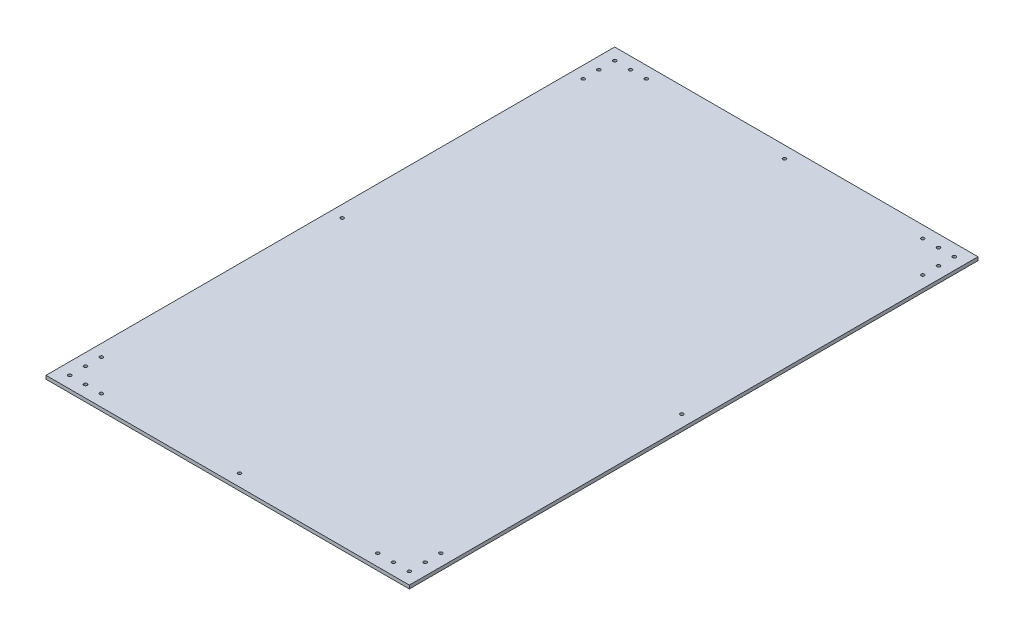
ISO-10303-21;
HEADER;
FILE_DESCRIPTION(('STEP AP214'),'2;1');
FILE_NAME('part.step','',(''),(''),'','','');
FILE_SCHEMA(('AUTOMOTIVE_DESIGN { 1 0 10303 214 1 1 1 1 }'));
ENDSEC;
DATA;
#1=APPLICATION_CONTEXT('core data for automotive mechanical design processes');
#2=APPLICATION_PROTOCOL_DEFINITION('international standard','automotive_design',2000,#1);
#3=PRODUCT_CONTEXT('',#1,'mechanical');
#4=PRODUCT('Part','Part','',(#3));
#5=PRODUCT_RELATED_PRODUCT_CATEGORY('part','',(#4));
#6=PRODUCT_DEFINITION_FORMATION('','',#4);
#7=PRODUCT_DEFINITION_CONTEXT('part definition',#1,'design');
#8=PRODUCT_DEFINITION('design','',#6,#7);
#9=PRODUCT_DEFINITION_SHAPE('','',#8);
#10=(LENGTH_UNIT() NAMED_UNIT(*) SI_UNIT(.MILLI.,.METRE.));
#11=(NAMED_UNIT(*) PLANE_ANGLE_UNIT() SI_UNIT($,.RADIAN.));
#12=(NAMED_UNIT(*) SI_UNIT($,.STERADIAN.) SOLID_ANGLE_UNIT());
#13=UNCERTAINTY_MEASURE_WITH_UNIT(LENGTH_MEASURE(1.E-05),#10,'distance_accuracy_value','');
#14=(GEOMETRIC_REPRESENTATION_CONTEXT(3) GLOBAL_UNCERTAINTY_ASSIGNED_CONTEXT((#13)) GLOBAL_UNIT_ASSIGNED_CONTEXT((#10,
#11,#12)) REPRESENTATION_CONTEXT('',''));
#15=CARTESIAN_POINT('',(0.,0.,0.));
#16=DIRECTION('',(0.,0.,1.));
#17=DIRECTION('',(1.,0.,0.));
#18=AXIS2_PLACEMENT_3D('',#15,#16,#17);
#19=CARTESIAN_POINT('',(304.8,5.5,-609.6));
#20=DIRECTION('',(-1.,0.,0.));
#21=DIRECTION('',(0.,0.,1.));
#22=AXIS2_PLACEMENT_3D('',#19,#20,#21);
#23=PLANE('',#22);
#24=DIRECTION('',(0.,0.,-1.));
#25=VECTOR('',#24,1.);
#26=CARTESIAN_POINT('',(304.8,0.,-609.6));
#27=LINE('',#26,#25);
#28=CARTESIAN_POINT('',(304.8,0.,609.6));
#29=VERTEX_POINT('',#28);
#30=CARTESIAN_POINT('',(304.8,0.,-304.8));
#31=VERTEX_POINT('',#30);
#32=EDGE_CURVE('E285',#29,#31,#27,.T.);
#33=ORIENTED_EDGE('',*,*,#32,.T.);
#34=DIRECTION('',(0.,-1.,0.));
#35=VECTOR('',#34,1.);
#36=CARTESIAN_POINT('',(304.8,30.901,-304.8));
#37=LINE('',#36,#35);
#38=CARTESIAN_POINT('',(304.8,5.5,-304.8));
#39=VERTEX_POINT('',#38);
#40=EDGE_CURVE('E89',#39,#31,#37,.T.);
#41=ORIENTED_EDGE('',*,*,#40,.F.);
#42=DIRECTION('',(0.,0.,-1.));
#43=VECTOR('',#42,1.);
#44=CARTESIAN_POINT('',(304.8,5.5,-609.6));
#45=LINE('',#44,#43);
#46=CARTESIAN_POINT('',(304.8,5.5,609.6));
#47=VERTEX_POINT('',#46);
#48=EDGE_CURVE('E286',#47,#39,#45,.T.);
#49=ORIENTED_EDGE('',*,*,#48,.F.);
#50=DIRECTION('',(0.,-1.,0.));
#51=VECTOR('',#50,1.);
#52=CARTESIAN_POINT('',(304.8,5.5,609.6));
#53=LINE('',#52,#51);
#54=EDGE_CURVE('E12',#47,#29,#53,.T.);
#55=ORIENTED_EDGE('',*,*,#54,.T.);
#56=EDGE_LOOP('',(#33,#41,#49,#55));
#57=FACE_BOUND('',#56,.T.);
#58=ADVANCED_FACE('F75',(#57),#23,.F.);
#59=CARTESIAN_POINT('',(-304.8,5.5,609.6));
#60=DIRECTION('',(0.,0.,-1.));
#61=DIRECTION('',(-1.,0.,0.));
#62=AXIS2_PLACEMENT_3D('',#59,#60,#61);
#63=PLANE('',#62);
#64=DIRECTION('',(1.,0.,0.));
#65=VECTOR('',#64,1.);
#66=CARTESIAN_POINT('',(-304.8,5.5,609.6));
#67=LINE('',#66,#65);
#68=CARTESIAN_POINT('',(-279.4,5.5,609.6));
#69=VERTEX_POINT('',#68);
#70=EDGE_CURVE('E82',#69,#47,#67,.T.);
#71=ORIENTED_EDGE('',*,*,#70,.F.);
#72=DIRECTION('',(0.,-1.,0.));
#73=VECTOR('',#72,1.);
#74=CARTESIAN_POINT('',(-279.4,30.901,609.6));
#75=LINE('',#74,#73);
#76=CARTESIAN_POINT('',(-279.4,0.,609.6));
#77=VERTEX_POINT('',#76);
#78=EDGE_CURVE('E123',#69,#77,#75,.T.);
#79=ORIENTED_EDGE('',*,*,#78,.T.);
#80=DIRECTION('',(1.,0.,0.));
#81=VECTOR('',#80,1.);
#82=CARTESIAN_POINT('',(-304.8,0.,609.6));
#83=LINE('',#82,#81);
#84=EDGE_CURVE('E133',#77,#29,#83,.T.);
#85=ORIENTED_EDGE('',*,*,#84,.T.);
#86=ORIENTED_EDGE('',*,*,#54,.F.);
#87=EDGE_LOOP('',(#71,#79,#85,#86));
#88=FACE_BOUND('',#87,.T.);
#89=ADVANCED_FACE('F290',(#88),#63,.F.);
#90=CARTESIAN_POINT('',(0.,5.5,0.));
#91=DIRECTION('',(0.,1.,0.));
#92=DIRECTION('',(0.,0.,1.));
#93=AXIS2_PLACEMENT_3D('',#90,#91,#92);
#94=PLANE('',#93);
#95=CARTESIAN_POINT('',(-260.35,5.5,-285.75));
#96=DIRECTION('',(0.,1.,0.));
#97=DIRECTION('',(0.,0.,1.));
#98=AXIS2_PLACEMENT_3D('',#95,#96,#97);
#99=CIRCLE('',#98,2.64999999999999);
#100=CARTESIAN_POINT('',(-260.35,5.5,-283.1));
#101=VERTEX_POINT('',#100);
#102=EDGE_CURVE('E137',#101,#101,#99,.T.);
#103=ORIENTED_EDGE('',*,*,#102,.F.);
#104=EDGE_LOOP('',(#103));
#105=FACE_BOUND('',#104,.T.);
#106=CARTESIAN_POINT('',(-234.95,5.5,-285.75));
#107=DIRECTION('',(0.,1.,0.));
#108=DIRECTION('',(0.,0.,1.));
#109=AXIS2_PLACEMENT_3D('',#106,#107,#108);
#110=CIRCLE('',#109,2.65000000000001);
#111=CARTESIAN_POINT('',(-234.95,5.5,-283.1));
#112=VERTEX_POINT('',#111);
#113=EDGE_CURVE('E144',#112,#112,#110,.T.);
#114=ORIENTED_EDGE('',*,*,#113,.F.);
#115=EDGE_LOOP('',(#114));
#116=FACE_BOUND('',#115,.T.);
#117=CARTESIAN_POINT('',(-209.55,5.5,-285.75));
#118=DIRECTION('',(0.,1.,0.));
#119=DIRECTION('',(0.,0.,1.));
#120=AXIS2_PLACEMENT_3D('',#117,#118,#119);
#121=CIRCLE('',#120,2.64999999999999);
#122=CARTESIAN_POINT('',(-209.55,5.5,-283.1));
#123=VERTEX_POINT('',#122);
#124=EDGE_CURVE('E150',#123,#123,#121,.T.);
#125=ORIENTED_EDGE('',*,*,#124,.F.);
#126=EDGE_LOOP('',(#125));
#127=FACE_BOUND('',#126,.T.);
#128=CARTESIAN_POINT('',(-260.35,5.5,-260.35));
#129=DIRECTION('',(0.,1.,0.));
#130=DIRECTION('',(0.,0.,1.));
#131=AXIS2_PLACEMENT_3D('',#128,#129,#130);
#132=CIRCLE('',#131,2.64999999999999);
#133=CARTESIAN_POINT('',(-260.35,5.5,-257.7));
#134=VERTEX_POINT('',#133);
#135=EDGE_CURVE('E156',#134,#134,#132,.T.);
#136=ORIENTED_EDGE('',*,*,#135,.F.);
#137=EDGE_LOOP('',(#136));
#138=FACE_BOUND('',#137,.T.);
#139=CARTESIAN_POINT('',(-260.35,5.5,-234.95));
#140=DIRECTION('',(0.,1.,0.));
#141=DIRECTION('',(0.,0.,1.));
#142=AXIS2_PLACEMENT_3D('',#139,#140,#141);
#143=CIRCLE('',#142,2.64999999999999);
#144=CARTESIAN_POINT('',(-260.35,5.5,-232.3));
#145=VERTEX_POINT('',#144);
#146=EDGE_CURVE('E162',#145,#145,#143,.T.);
#147=ORIENTED_EDGE('',*,*,#146,.F.);
#148=EDGE_LOOP('',(#147));
#149=FACE_BOUND('',#148,.T.);
#150=CARTESIAN_POINT('',(12.7000000000002,5.5,-285.75));
#151=DIRECTION('',(0.,1.,0.));
#152=DIRECTION('',(0.,0.,1.));
#153=AXIS2_PLACEMENT_3D('',#150,#151,#152);
#154=CIRCLE('',#153,2.65);
#155=CARTESIAN_POINT('',(12.7000000000002,5.5,-283.1));
#156=VERTEX_POINT('',#155);
#157=EDGE_CURVE('E168',#156,#156,#154,.T.);
#158=ORIENTED_EDGE('',*,*,#157,.F.);
#159=EDGE_LOOP('',(#158));
#160=FACE_BOUND('',#159,.T.);
#161=CARTESIAN_POINT('',(234.95,5.5,-285.75));
#162=DIRECTION('',(0.,1.,0.));
#163=DIRECTION('',(0.,0.,1.));
#164=AXIS2_PLACEMENT_3D('',#161,#162,#163);
#165=CIRCLE('',#164,2.64999999999999);
#166=CARTESIAN_POINT('',(234.95,5.5,-283.1));
#167=VERTEX_POINT('',#166);
#168=EDGE_CURVE('E174',#167,#167,#165,.T.);
#169=ORIENTED_EDGE('',*,*,#168,.F.);
#170=EDGE_LOOP('',(#169));
#171=FACE_BOUND('',#170,.T.);
#172=CARTESIAN_POINT('',(260.35,5.5,-285.75));
#173=DIRECTION('',(0.,1.,0.));
#174=DIRECTION('',(0.,0.,1.));
#175=AXIS2_PLACEMENT_3D('',#172,#173,#174);
#176=CIRCLE('',#175,2.64999999999999);
#177=CARTESIAN_POINT('',(260.35,5.5,-283.1));
#178=VERTEX_POINT('',#177);
#179=EDGE_CURVE('E180',#178,#178,#176,.T.);
#180=ORIENTED_EDGE('',*,*,#179,.F.);
#181=EDGE_LOOP('',(#180));
#182=FACE_BOUND('',#181,.T.);
#183=CARTESIAN_POINT('',(285.75,5.5,-285.75));
#184=DIRECTION('',(0.,1.,0.));
#185=DIRECTION('',(0.,0.,1.));
#186=AXIS2_PLACEMENT_3D('',#183,#184,#185);
#187=CIRCLE('',#186,2.64999999999999);
#188=CARTESIAN_POINT('',(285.75,5.5,-283.1));
#189=VERTEX_POINT('',#188);
#190=EDGE_CURVE('E186',#189,#189,#187,.T.);
#191=ORIENTED_EDGE('',*,*,#190,.F.);
#192=EDGE_LOOP('',(#191));
#193=FACE_BOUND('',#192,.T.);
#194=CARTESIAN_POINT('',(285.75,5.5,-260.35));
#195=DIRECTION('',(0.,1.,0.));
#196=DIRECTION('',(0.,0.,1.));
#197=AXIS2_PLACEMENT_3D('',#194,#195,#196);
#198=CIRCLE('',#197,2.64999999999999);
#199=CARTESIAN_POINT('',(285.75,5.5,-257.7));
#200=VERTEX_POINT('',#199);
#201=EDGE_CURVE('E192',#200,#200,#198,.T.);
#202=ORIENTED_EDGE('',*,*,#201,.F.);
#203=EDGE_LOOP('',(#202));
#204=FACE_BOUND('',#203,.T.);
#205=CARTESIAN_POINT('',(285.75,5.5,-234.95));
#206=DIRECTION('',(0.,1.,0.));
#207=DIRECTION('',(0.,0.,1.));
#208=AXIS2_PLACEMENT_3D('',#205,#206,#207);
#209=CIRCLE('',#208,2.64999999999999);
#210=CARTESIAN_POINT('',(285.75,5.5,-232.3));
#211=VERTEX_POINT('',#210);
#212=EDGE_CURVE('E198',#211,#211,#209,.T.);
#213=ORIENTED_EDGE('',*,*,#212,.F.);
#214=EDGE_LOOP('',(#213));
#215=FACE_BOUND('',#214,.T.);
#216=CARTESIAN_POINT('',(-260.35,5.5,152.4));
#217=DIRECTION('',(0.,1.,0.));
#218=DIRECTION('',(0.,0.,1.));
#219=AXIS2_PLACEMENT_3D('',#216,#217,#218);
#220=CIRCLE('',#219,2.64999999999999);
#221=CARTESIAN_POINT('',(-260.35,5.5,155.05));
#222=VERTEX_POINT('',#221);
#223=EDGE_CURVE('E204',#222,#222,#220,.T.);
#224=ORIENTED_EDGE('',*,*,#223,.F.);
#225=EDGE_LOOP('',(#224));
#226=FACE_BOUND('',#225,.T.);
#227=CARTESIAN_POINT('',(285.75,5.5,152.4));
#228=DIRECTION('',(0.,1.,0.));
#229=DIRECTION('',(0.,0.,1.));
#230=AXIS2_PLACEMENT_3D('',#227,#228,#229);
#231=CIRCLE('',#230,2.64999999999999);
#232=CARTESIAN_POINT('',(285.75,5.5,155.05));
#233=VERTEX_POINT('',#232);
#234=EDGE_CURVE('E210',#233,#233,#231,.T.);
#235=ORIENTED_EDGE('',*,*,#234,.F.);
#236=EDGE_LOOP('',(#235));
#237=FACE_BOUND('',#236,.T.);
#238=CARTESIAN_POINT('',(-260.35,5.5,539.75));
#239=DIRECTION('',(0.,1.,0.));
#240=DIRECTION('',(0.,0.,1.));
#241=AXIS2_PLACEMENT_3D('',#238,#239,#240);
#242=CIRCLE('',#241,2.64999999999999);
#243=CARTESIAN_POINT('',(-260.35,5.5,542.4));
#244=VERTEX_POINT('',#243);
#245=EDGE_CURVE('E216',#244,#244,#242,.T.);
#246=ORIENTED_EDGE('',*,*,#245,.F.);
#247=EDGE_LOOP('',(#246));
#248=FACE_BOUND('',#247,.T.);
#249=CARTESIAN_POINT('',(-260.35,5.5,565.15));
#250=DIRECTION('',(0.,1.,0.));
#251=DIRECTION('',(0.,0.,1.));
#252=AXIS2_PLACEMENT_3D('',#249,#250,#251);
#253=CIRCLE('',#252,2.64999999999999);
#254=CARTESIAN_POINT('',(-260.35,5.5,567.8));
#255=VERTEX_POINT('',#254);
#256=EDGE_CURVE('E222',#255,#255,#253,.T.);
#257=ORIENTED_EDGE('',*,*,#256,.F.);
#258=EDGE_LOOP('',(#257));
#259=FACE_BOUND('',#258,.T.);
#260=CARTESIAN_POINT('',(-260.35,5.5,590.55));
#261=DIRECTION('',(0.,1.,0.));
#262=DIRECTION('',(0.,0.,1.));
#263=AXIS2_PLACEMENT_3D('',#260,#261,#262);
#264=CIRCLE('',#263,2.64999999999999);
#265=CARTESIAN_POINT('',(-260.35,5.5,593.2));
#266=VERTEX_POINT('',#265);
#267=EDGE_CURVE('E228',#266,#266,#264,.T.);
#268=ORIENTED_EDGE('',*,*,#267,.F.);
#269=EDGE_LOOP('',(#268));
#270=FACE_BOUND('',#269,.T.);
#271=CARTESIAN_POINT('',(-234.95,5.5,590.55));
#272=DIRECTION('',(0.,1.,0.));
#273=DIRECTION('',(0.,0.,1.));
#274=AXIS2_PLACEMENT_3D('',#271,#272,#273);
#275=CIRCLE('',#274,2.65000000000001);
#276=CARTESIAN_POINT('',(-234.95,5.5,593.2));
#277=VERTEX_POINT('',#276);
#278=EDGE_CURVE('E234',#277,#277,#275,.T.);
#279=ORIENTED_EDGE('',*,*,#278,.F.);
#280=EDGE_LOOP('',(#279));
#281=FACE_BOUND('',#280,.T.);
#282=CARTESIAN_POINT('',(-209.55,5.5,590.55));
#283=DIRECTION('',(0.,1.,0.));
#284=DIRECTION('',(0.,0.,1.));
#285=AXIS2_PLACEMENT_3D('',#282,#283,#284);
#286=CIRCLE('',#285,2.64999999999999);
#287=CARTESIAN_POINT('',(-209.55,5.5,593.2));
#288=VERTEX_POINT('',#287);
#289=EDGE_CURVE('E240',#288,#288,#286,.T.);
#290=ORIENTED_EDGE('',*,*,#289,.F.);
#291=EDGE_LOOP('',(#290));
#292=FACE_BOUND('',#291,.T.);
#293=CARTESIAN_POINT('',(12.7000000000002,5.5,590.55));
#294=DIRECTION('',(0.,1.,0.));
#295=DIRECTION('',(0.,0.,1.));
#296=AXIS2_PLACEMENT_3D('',#293,#294,#295);
#297=CIRCLE('',#296,2.65);
#298=CARTESIAN_POINT('',(12.7000000000002,5.5,593.2));
#299=VERTEX_POINT('',#298);
#300=EDGE_CURVE('E246',#299,#299,#297,.T.);
#301=ORIENTED_EDGE('',*,*,#300,.F.);
#302=EDGE_LOOP('',(#301));
#303=FACE_BOUND('',#302,.T.);
#304=CARTESIAN_POINT('',(234.95,5.5,590.55));
#305=DIRECTION('',(0.,1.,0.));
#306=DIRECTION('',(0.,0.,1.));
#307=AXIS2_PLACEMENT_3D('',#304,#305,#306);
#308=CIRCLE('',#307,2.64999999999999);
#309=CARTESIAN_POINT('',(234.95,5.5,593.2));
#310=VERTEX_POINT('',#309);
#311=EDGE_CURVE('E252',#310,#310,#308,.T.);
#312=ORIENTED_EDGE('',*,*,#311,.F.);
#313=EDGE_LOOP('',(#312));
#314=FACE_BOUND('',#313,.T.);
#315=CARTESIAN_POINT('',(260.35,5.5,590.55));
#316=DIRECTION('',(0.,1.,0.));
#317=DIRECTION('',(0.,0.,1.));
#318=AXIS2_PLACEMENT_3D('',#315,#316,#317);
#319=CIRCLE('',#318,2.64999999999999);
#320=CARTESIAN_POINT('',(260.35,5.5,593.2));
#321=VERTEX_POINT('',#320);
#322=EDGE_CURVE('E258',#321,#321,#319,.T.);
#323=ORIENTED_EDGE('',*,*,#322,.F.);
#324=EDGE_LOOP('',(#323));
#325=FACE_BOUND('',#324,.T.);
#326=CARTESIAN_POINT('',(285.75,5.5,590.55));
#327=DIRECTION('',(0.,1.,0.));
#328=DIRECTION('',(0.,0.,1.));
#329=AXIS2_PLACEMENT_3D('',#326,#327,#328);
#330=CIRCLE('',#329,2.64999999999999);
#331=CARTESIAN_POINT('',(285.75,5.5,593.2));
#332=VERTEX_POINT('',#331);
#333=EDGE_CURVE('E264',#332,#332,#330,.T.);
#334=ORIENTED_EDGE('',*,*,#333,.F.);
#335=EDGE_LOOP('',(#334));
#336=FACE_BOUND('',#335,.T.);
#337=CARTESIAN_POINT('',(285.75,5.5,565.15));
#338=DIRECTION('',(0.,1.,0.));
#339=DIRECTION('',(0.,0.,1.));
#340=AXIS2_PLACEMENT_3D('',#337,#338,#339);
#341=CIRCLE('',#340,2.64999999999999);
#342=CARTESIAN_POINT('',(285.75,5.5,567.8));
#343=VERTEX_POINT('',#342);
#344=EDGE_CURVE('E270',#343,#343,#341,.T.);
#345=ORIENTED_EDGE('',*,*,#344,.F.);
#346=EDGE_LOOP('',(#345));
#347=FACE_BOUND('',#346,.T.);
#348=CARTESIAN_POINT('',(285.75,5.5,539.75));
#349=DIRECTION('',(0.,1.,0.));
#350=DIRECTION('',(0.,0.,1.));
#351=AXIS2_PLACEMENT_3D('',#348,#349,#350);
#352=CIRCLE('',#351,2.64999999999999);
#353=CARTESIAN_POINT('',(285.75,5.5,542.4));
#354=VERTEX_POINT('',#353);
#355=EDGE_CURVE('E276',#354,#354,#352,.T.);
#356=ORIENTED_EDGE('',*,*,#355,.F.);
#357=EDGE_LOOP('',(#356));
#358=FACE_BOUND('',#357,.T.);
#359=DIRECTION('',(0.,0.,1.));
#360=VECTOR('',#359,1.);
#361=CARTESIAN_POINT('',(-279.4,5.5,-609.6));
#362=LINE('',#361,#360);
#363=CARTESIAN_POINT('',(-279.4,5.5,-304.8));
#364=VERTEX_POINT('',#363);
#365=EDGE_CURVE('E121',#364,#69,#362,.T.);
#366=ORIENTED_EDGE('',*,*,#365,.T.);
#367=ORIENTED_EDGE('',*,*,#70,.T.);
#368=ORIENTED_EDGE('',*,*,#48,.T.);
#369=DIRECTION('',(1.,0.,0.));
#370=VECTOR('',#369,1.);
#371=CARTESIAN_POINT('',(-279.4,5.5,-304.8));
#372=LINE('',#371,#370);
#373=EDGE_CURVE('E283',#364,#39,#372,.T.);
#374=ORIENTED_EDGE('',*,*,#373,.F.);
#375=EDGE_LOOP('',(#366,#367,#368,#374));
#376=FACE_BOUND('',#375,.T.);
#377=ADVANCED_FACE('F293',(#105,#116,#127,#138,#149,#160,#171,#182,#193,#204,#215,#226,#237,
#248,#259,#270,#281,#292,#303,#314,#325,#336,#347,#358,#376),#94,.T.);
#378=CARTESIAN_POINT('',(0.,0.,0.));
#379=DIRECTION('',(0.,1.,0.));
#380=DIRECTION('',(0.,0.,1.));
#381=AXIS2_PLACEMENT_3D('',#378,#379,#380);
#382=PLANE('',#381);
#383=CARTESIAN_POINT('',(-260.35,0.,-285.75));
#384=DIRECTION('',(0.,1.,0.));
#385=DIRECTION('',(0.,0.,1.));
#386=AXIS2_PLACEMENT_3D('',#383,#384,#385);
#387=CIRCLE('',#386,2.64999999999999);
#388=CARTESIAN_POINT('',(-260.35,0.,-283.1));
#389=VERTEX_POINT('',#388);
#390=EDGE_CURVE('E141',#389,#389,#387,.T.);
#391=ORIENTED_EDGE('',*,*,#390,.T.);
#392=EDGE_LOOP('',(#391));
#393=FACE_BOUND('',#392,.T.);
#394=CARTESIAN_POINT('',(-234.95,0.,-285.75));
#395=DIRECTION('',(0.,1.,0.));
#396=DIRECTION('',(0.,0.,1.));
#397=AXIS2_PLACEMENT_3D('',#394,#395,#396);
#398=CIRCLE('',#397,2.64999999999999);
#399=CARTESIAN_POINT('',(-234.95,0.,-283.1));
#400=VERTEX_POINT('',#399);
#401=EDGE_CURVE('E147',#400,#400,#398,.T.);
#402=ORIENTED_EDGE('',*,*,#401,.T.);
#403=EDGE_LOOP('',(#402));
#404=FACE_BOUND('',#403,.T.);
#405=CARTESIAN_POINT('',(-209.55,0.,-285.75));
#406=DIRECTION('',(0.,1.,0.));
#407=DIRECTION('',(0.,0.,1.));
#408=AXIS2_PLACEMENT_3D('',#405,#406,#407);
#409=CIRCLE('',#408,2.64999999999999);
#410=CARTESIAN_POINT('',(-209.55,0.,-283.1));
#411=VERTEX_POINT('',#410);
#412=EDGE_CURVE('E153',#411,#411,#409,.T.);
#413=ORIENTED_EDGE('',*,*,#412,.T.);
#414=EDGE_LOOP('',(#413));
#415=FACE_BOUND('',#414,.T.);
#416=CARTESIAN_POINT('',(-260.35,0.,-260.35));
#417=DIRECTION('',(0.,1.,0.));
#418=DIRECTION('',(0.,0.,1.));
#419=AXIS2_PLACEMENT_3D('',#416,#417,#418);
#420=CIRCLE('',#419,2.64999999999999);
#421=CARTESIAN_POINT('',(-260.35,0.,-257.7));
#422=VERTEX_POINT('',#421);
#423=EDGE_CURVE('E159',#422,#422,#420,.T.);
#424=ORIENTED_EDGE('',*,*,#423,.T.);
#425=EDGE_LOOP('',(#424));
#426=FACE_BOUND('',#425,.T.);
#427=CARTESIAN_POINT('',(-260.35,0.,-234.95));
#428=DIRECTION('',(0.,1.,0.));
#429=DIRECTION('',(0.,0.,1.));
#430=AXIS2_PLACEMENT_3D('',#427,#428,#429);
#431=CIRCLE('',#430,2.64999999999999);
#432=CARTESIAN_POINT('',(-260.35,0.,-232.3));
#433=VERTEX_POINT('',#432);
#434=EDGE_CURVE('E165',#433,#433,#431,.T.);
#435=ORIENTED_EDGE('',*,*,#434,.T.);
#436=EDGE_LOOP('',(#435));
#437=FACE_BOUND('',#436,.T.);
#438=CARTESIAN_POINT('',(12.7000000000002,0.,-285.75));
#439=DIRECTION('',(0.,1.,0.));
#440=DIRECTION('',(0.,0.,1.));
#441=AXIS2_PLACEMENT_3D('',#438,#439,#440);
#442=CIRCLE('',#441,2.65);
#443=CARTESIAN_POINT('',(12.7000000000002,0.,-283.1));
#444=VERTEX_POINT('',#443);
#445=EDGE_CURVE('E171',#444,#444,#442,.T.);
#446=ORIENTED_EDGE('',*,*,#445,.T.);
#447=EDGE_LOOP('',(#446));
#448=FACE_BOUND('',#447,.T.);
#449=CARTESIAN_POINT('',(234.95,0.,-285.75));
#450=DIRECTION('',(0.,1.,0.));
#451=DIRECTION('',(0.,0.,1.));
#452=AXIS2_PLACEMENT_3D('',#449,#450,#451);
#453=CIRCLE('',#452,2.64999999999999);
#454=CARTESIAN_POINT('',(234.95,0.,-283.1));
#455=VERTEX_POINT('',#454);
#456=EDGE_CURVE('E177',#455,#455,#453,.T.);
#457=ORIENTED_EDGE('',*,*,#456,.T.);
#458=EDGE_LOOP('',(#457));
#459=FACE_BOUND('',#458,.T.);
#460=CARTESIAN_POINT('',(260.35,0.,-285.75));
#461=DIRECTION('',(0.,1.,0.));
#462=DIRECTION('',(0.,0.,1.));
#463=AXIS2_PLACEMENT_3D('',#460,#461,#462);
#464=CIRCLE('',#463,2.64999999999999);
#465=CARTESIAN_POINT('',(260.35,0.,-283.1));
#466=VERTEX_POINT('',#465);
#467=EDGE_CURVE('E183',#466,#466,#464,.T.);
#468=ORIENTED_EDGE('',*,*,#467,.T.);
#469=EDGE_LOOP('',(#468));
#470=FACE_BOUND('',#469,.T.);
#471=CARTESIAN_POINT('',(285.75,0.,-285.75));
#472=DIRECTION('',(0.,1.,0.));
#473=DIRECTION('',(0.,0.,1.));
#474=AXIS2_PLACEMENT_3D('',#471,#472,#473);
#475=CIRCLE('',#474,2.64999999999999);
#476=CARTESIAN_POINT('',(285.75,0.,-283.1));
#477=VERTEX_POINT('',#476);
#478=EDGE_CURVE('E189',#477,#477,#475,.T.);
#479=ORIENTED_EDGE('',*,*,#478,.T.);
#480=EDGE_LOOP('',(#479));
#481=FACE_BOUND('',#480,.T.);
#482=CARTESIAN_POINT('',(285.75,0.,-260.35));
#483=DIRECTION('',(0.,1.,0.));
#484=DIRECTION('',(0.,0.,1.));
#485=AXIS2_PLACEMENT_3D('',#482,#483,#484);
#486=CIRCLE('',#485,2.64999999999999);
#487=CARTESIAN_POINT('',(285.75,0.,-257.7));
#488=VERTEX_POINT('',#487);
#489=EDGE_CURVE('E195',#488,#488,#486,.T.);
#490=ORIENTED_EDGE('',*,*,#489,.T.);
#491=EDGE_LOOP('',(#490));
#492=FACE_BOUND('',#491,.T.);
#493=CARTESIAN_POINT('',(285.75,0.,-234.95));
#494=DIRECTION('',(0.,1.,0.));
#495=DIRECTION('',(0.,0.,1.));
#496=AXIS2_PLACEMENT_3D('',#493,#494,#495);
#497=CIRCLE('',#496,2.64999999999999);
#498=CARTESIAN_POINT('',(285.75,0.,-232.3));
#499=VERTEX_POINT('',#498);
#500=EDGE_CURVE('E201',#499,#499,#497,.T.);
#501=ORIENTED_EDGE('',*,*,#500,.T.);
#502=EDGE_LOOP('',(#501));
#503=FACE_BOUND('',#502,.T.);
#504=CARTESIAN_POINT('',(-260.35,0.,152.4));
#505=DIRECTION('',(0.,1.,0.));
#506=DIRECTION('',(0.,0.,1.));
#507=AXIS2_PLACEMENT_3D('',#504,#505,#506);
#508=CIRCLE('',#507,2.64999999999999);
#509=CARTESIAN_POINT('',(-260.35,0.,155.05));
#510=VERTEX_POINT('',#509);
#511=EDGE_CURVE('E207',#510,#510,#508,.T.);
#512=ORIENTED_EDGE('',*,*,#511,.T.);
#513=EDGE_LOOP('',(#512));
#514=FACE_BOUND('',#513,.T.);
#515=CARTESIAN_POINT('',(285.75,0.,152.4));
#516=DIRECTION('',(0.,1.,0.));
#517=DIRECTION('',(0.,0.,1.));
#518=AXIS2_PLACEMENT_3D('',#515,#516,#517);
#519=CIRCLE('',#518,2.64999999999999);
#520=CARTESIAN_POINT('',(285.75,0.,155.05));
#521=VERTEX_POINT('',#520);
#522=EDGE_CURVE('E213',#521,#521,#519,.T.);
#523=ORIENTED_EDGE('',*,*,#522,.T.);
#524=EDGE_LOOP('',(#523));
#525=FACE_BOUND('',#524,.T.);
#526=CARTESIAN_POINT('',(-260.35,0.,539.75));
#527=DIRECTION('',(0.,1.,0.));
#528=DIRECTION('',(0.,0.,1.));
#529=AXIS2_PLACEMENT_3D('',#526,#527,#528);
#530=CIRCLE('',#529,2.64999999999999);
#531=CARTESIAN_POINT('',(-260.35,0.,542.4));
#532=VERTEX_POINT('',#531);
#533=EDGE_CURVE('E219',#532,#532,#530,.T.);
#534=ORIENTED_EDGE('',*,*,#533,.T.);
#535=EDGE_LOOP('',(#534));
#536=FACE_BOUND('',#535,.T.);
#537=CARTESIAN_POINT('',(-260.35,0.,565.15));
#538=DIRECTION('',(0.,1.,0.));
#539=DIRECTION('',(0.,0.,1.));
#540=AXIS2_PLACEMENT_3D('',#537,#538,#539);
#541=CIRCLE('',#540,2.64999999999999);
#542=CARTESIAN_POINT('',(-260.35,0.,567.8));
#543=VERTEX_POINT('',#542);
#544=EDGE_CURVE('E225',#543,#543,#541,.T.);
#545=ORIENTED_EDGE('',*,*,#544,.T.);
#546=EDGE_LOOP('',(#545));
#547=FACE_BOUND('',#546,.T.);
#548=CARTESIAN_POINT('',(-260.35,0.,590.55));
#549=DIRECTION('',(0.,1.,0.));
#550=DIRECTION('',(0.,0.,1.));
#551=AXIS2_PLACEMENT_3D('',#548,#549,#550);
#552=CIRCLE('',#551,2.64999999999999);
#553=CARTESIAN_POINT('',(-260.35,0.,593.2));
#554=VERTEX_POINT('',#553);
#555=EDGE_CURVE('E231',#554,#554,#552,.T.);
#556=ORIENTED_EDGE('',*,*,#555,.T.);
#557=EDGE_LOOP('',(#556));
#558=FACE_BOUND('',#557,.T.);
#559=CARTESIAN_POINT('',(-234.95,0.,590.55));
#560=DIRECTION('',(0.,1.,0.));
#561=DIRECTION('',(0.,0.,1.));
#562=AXIS2_PLACEMENT_3D('',#559,#560,#561);
#563=CIRCLE('',#562,2.64999999999999);
#564=CARTESIAN_POINT('',(-234.95,0.,593.2));
#565=VERTEX_POINT('',#564);
#566=EDGE_CURVE('E237',#565,#565,#563,.T.);
#567=ORIENTED_EDGE('',*,*,#566,.T.);
#568=EDGE_LOOP('',(#567));
#569=FACE_BOUND('',#568,.T.);
#570=CARTESIAN_POINT('',(-209.55,0.,590.55));
#571=DIRECTION('',(0.,1.,0.));
#572=DIRECTION('',(0.,0.,1.));
#573=AXIS2_PLACEMENT_3D('',#570,#571,#572);
#574=CIRCLE('',#573,2.64999999999999);
#575=CARTESIAN_POINT('',(-209.55,0.,593.2));
#576=VERTEX_POINT('',#575);
#577=EDGE_CURVE('E243',#576,#576,#574,.T.);
#578=ORIENTED_EDGE('',*,*,#577,.T.);
#579=EDGE_LOOP('',(#578));
#580=FACE_BOUND('',#579,.T.);
#581=CARTESIAN_POINT('',(12.7000000000002,0.,590.55));
#582=DIRECTION('',(0.,1.,0.));
#583=DIRECTION('',(0.,0.,1.));
#584=AXIS2_PLACEMENT_3D('',#581,#582,#583);
#585=CIRCLE('',#584,2.65);
#586=CARTESIAN_POINT('',(12.7000000000002,0.,593.2));
#587=VERTEX_POINT('',#586);
#588=EDGE_CURVE('E249',#587,#587,#585,.T.);
#589=ORIENTED_EDGE('',*,*,#588,.T.);
#590=EDGE_LOOP('',(#589));
#591=FACE_BOUND('',#590,.T.);
#592=CARTESIAN_POINT('',(234.95,0.,590.55));
#593=DIRECTION('',(0.,1.,0.));
#594=DIRECTION('',(0.,0.,1.));
#595=AXIS2_PLACEMENT_3D('',#592,#593,#594);
#596=CIRCLE('',#595,2.64999999999999);
#597=CARTESIAN_POINT('',(234.95,0.,593.2));
#598=VERTEX_POINT('',#597);
#599=EDGE_CURVE('E255',#598,#598,#596,.T.);
#600=ORIENTED_EDGE('',*,*,#599,.T.);
#601=EDGE_LOOP('',(#600));
#602=FACE_BOUND('',#601,.T.);
#603=CARTESIAN_POINT('',(260.35,0.,590.55));
#604=DIRECTION('',(0.,1.,0.));
#605=DIRECTION('',(0.,0.,1.));
#606=AXIS2_PLACEMENT_3D('',#603,#604,#605);
#607=CIRCLE('',#606,2.64999999999999);
#608=CARTESIAN_POINT('',(260.35,0.,593.2));
#609=VERTEX_POINT('',#608);
#610=EDGE_CURVE('E261',#609,#609,#607,.T.);
#611=ORIENTED_EDGE('',*,*,#610,.T.);
#612=EDGE_LOOP('',(#611));
#613=FACE_BOUND('',#612,.T.);
#614=CARTESIAN_POINT('',(285.75,0.,590.55));
#615=DIRECTION('',(0.,1.,0.));
#616=DIRECTION('',(0.,0.,1.));
#617=AXIS2_PLACEMENT_3D('',#614,#615,#616);
#618=CIRCLE('',#617,2.64999999999999);
#619=CARTESIAN_POINT('',(285.75,0.,593.2));
#620=VERTEX_POINT('',#619);
#621=EDGE_CURVE('E267',#620,#620,#618,.T.);
#622=ORIENTED_EDGE('',*,*,#621,.T.);
#623=EDGE_LOOP('',(#622));
#624=FACE_BOUND('',#623,.T.);
#625=CARTESIAN_POINT('',(285.75,0.,565.15));
#626=DIRECTION('',(0.,1.,0.));
#627=DIRECTION('',(0.,0.,1.));
#628=AXIS2_PLACEMENT_3D('',#625,#626,#627);
#629=CIRCLE('',#628,2.64999999999999);
#630=CARTESIAN_POINT('',(285.75,0.,567.8));
#631=VERTEX_POINT('',#630);
#632=EDGE_CURVE('E273',#631,#631,#629,.T.);
#633=ORIENTED_EDGE('',*,*,#632,.T.);
#634=EDGE_LOOP('',(#633));
#635=FACE_BOUND('',#634,.T.);
#636=CARTESIAN_POINT('',(285.75,0.,539.75));
#637=DIRECTION('',(0.,1.,0.));
#638=DIRECTION('',(0.,0.,1.));
#639=AXIS2_PLACEMENT_3D('',#636,#637,#638);
#640=CIRCLE('',#639,2.64999999999999);
#641=CARTESIAN_POINT('',(285.75,0.,542.4));
#642=VERTEX_POINT('',#641);
#643=EDGE_CURVE('E279',#642,#642,#640,.T.);
#644=ORIENTED_EDGE('',*,*,#643,.T.);
#645=EDGE_LOOP('',(#644));
#646=FACE_BOUND('',#645,.T.);
#647=ORIENTED_EDGE('',*,*,#84,.F.);
#648=DIRECTION('',(0.,0.,1.));
#649=VECTOR('',#648,1.);
#650=CARTESIAN_POINT('',(-279.4,0.,609.6));
#651=LINE('',#650,#649);
#652=CARTESIAN_POINT('',(-279.4,0.,-304.8));
#653=VERTEX_POINT('',#652);
#654=EDGE_CURVE('E119',#653,#77,#651,.T.);
#655=ORIENTED_EDGE('',*,*,#654,.F.);
#656=DIRECTION('',(-1.,0.,0.));
#657=VECTOR('',#656,1.);
#658=CARTESIAN_POINT('',(-279.4,0.,-304.8));
#659=LINE('',#658,#657);
#660=EDGE_CURVE('E125',#31,#653,#659,.T.);
#661=ORIENTED_EDGE('',*,*,#660,.F.);
#662=ORIENTED_EDGE('',*,*,#32,.F.);
#663=EDGE_LOOP('',(#647,#655,#661,#662));
#664=FACE_BOUND('',#663,.T.);
#665=ADVANCED_FACE('F132',(#393,#404,#415,#426,#437,#448,#459,#470,#481,#492,#503,#514,#525,
#536,#547,#558,#569,#580,#591,#602,#613,#624,#635,#646,#664),#382,.F.);
#666=CARTESIAN_POINT('',(285.75,5.5,539.75));
#667=DIRECTION('',(0.,1.,0.));
#668=DIRECTION('',(0.,0.,1.));
#669=AXIS2_PLACEMENT_3D('',#666,#667,#668);
#670=CYLINDRICAL_SURFACE('',#669,2.64999999999999);
#671=ORIENTED_EDGE('',*,*,#643,.F.);
#672=EDGE_LOOP('',(#671));
#673=FACE_BOUND('',#672,.T.);
#674=ORIENTED_EDGE('',*,*,#355,.T.);
#675=EDGE_LOOP('',(#674));
#676=FACE_BOUND('',#675,.T.);
#677=ADVANCED_FACE('F300',(#673,#676),#670,.F.);
#678=CARTESIAN_POINT('',(285.75,5.5,565.15));
#679=DIRECTION('',(0.,1.,0.));
#680=DIRECTION('',(0.,0.,1.));
#681=AXIS2_PLACEMENT_3D('',#678,#679,#680);
#682=CYLINDRICAL_SURFACE('',#681,2.64999999999999);
#683=ORIENTED_EDGE('',*,*,#632,.F.);
#684=EDGE_LOOP('',(#683));
#685=FACE_BOUND('',#684,.T.);
#686=ORIENTED_EDGE('',*,*,#344,.T.);
#687=EDGE_LOOP('',(#686));
#688=FACE_BOUND('',#687,.T.);
#689=ADVANCED_FACE('F542',(#685,#688),#682,.F.);
#690=CARTESIAN_POINT('',(285.75,5.5,590.55));
#691=DIRECTION('',(0.,1.,0.));
#692=DIRECTION('',(0.,0.,1.));
#693=AXIS2_PLACEMENT_3D('',#690,#691,#692);
#694=CYLINDRICAL_SURFACE('',#693,2.64999999999999);
#695=ORIENTED_EDGE('',*,*,#621,.F.);
#696=EDGE_LOOP('',(#695));
#697=FACE_BOUND('',#696,.T.);
#698=ORIENTED_EDGE('',*,*,#333,.T.);
#699=EDGE_LOOP('',(#698));
#700=FACE_BOUND('',#699,.T.);
#701=ADVANCED_FACE('F533',(#697,#700),#694,.F.);
#702=CARTESIAN_POINT('',(260.35,5.5,590.55));
#703=DIRECTION('',(0.,1.,0.));
#704=DIRECTION('',(0.,0.,1.));
#705=AXIS2_PLACEMENT_3D('',#702,#703,#704);
#706=CYLINDRICAL_SURFACE('',#705,2.64999999999999);
#707=ORIENTED_EDGE('',*,*,#610,.F.);
#708=EDGE_LOOP('',(#707));
#709=FACE_BOUND('',#708,.T.);
#710=ORIENTED_EDGE('',*,*,#322,.T.);
#711=EDGE_LOOP('',(#710));
#712=FACE_BOUND('',#711,.T.);
#713=ADVANCED_FACE('F524',(#709,#712),#706,.F.);
#714=CARTESIAN_POINT('',(234.95,5.5,590.55));
#715=DIRECTION('',(0.,1.,0.));
#716=DIRECTION('',(0.,0.,1.));
#717=AXIS2_PLACEMENT_3D('',#714,#715,#716);
#718=CYLINDRICAL_SURFACE('',#717,2.64999999999999);
#719=ORIENTED_EDGE('',*,*,#599,.F.);
#720=EDGE_LOOP('',(#719));
#721=FACE_BOUND('',#720,.T.);
#722=ORIENTED_EDGE('',*,*,#311,.T.);
#723=EDGE_LOOP('',(#722));
#724=FACE_BOUND('',#723,.T.);
#725=ADVANCED_FACE('F515',(#721,#724),#718,.F.);
#726=CARTESIAN_POINT('',(12.7000000000002,5.5,590.55));
#727=DIRECTION('',(0.,1.,0.));
#728=DIRECTION('',(0.,0.,1.));
#729=AXIS2_PLACEMENT_3D('',#726,#727,#728);
#730=CYLINDRICAL_SURFACE('',#729,2.65);
#731=ORIENTED_EDGE('',*,*,#588,.F.);
#732=EDGE_LOOP('',(#731));
#733=FACE_BOUND('',#732,.T.);
#734=ORIENTED_EDGE('',*,*,#300,.T.);
#735=EDGE_LOOP('',(#734));
#736=FACE_BOUND('',#735,.T.);
#737=ADVANCED_FACE('F506',(#733,#736),#730,.F.);
#738=CARTESIAN_POINT('',(-209.55,5.5,590.55));
#739=DIRECTION('',(0.,1.,0.));
#740=DIRECTION('',(0.,0.,1.));
#741=AXIS2_PLACEMENT_3D('',#738,#739,#740);
#742=CYLINDRICAL_SURFACE('',#741,2.64999999999999);
#743=ORIENTED_EDGE('',*,*,#577,.F.);
#744=EDGE_LOOP('',(#743));
#745=FACE_BOUND('',#744,.T.);
#746=ORIENTED_EDGE('',*,*,#289,.T.);
#747=EDGE_LOOP('',(#746));
#748=FACE_BOUND('',#747,.T.);
#749=ADVANCED_FACE('F497',(#745,#748),#742,.F.);
#750=CARTESIAN_POINT('',(-234.95,5.5,590.55));
#751=DIRECTION('',(0.,1.,0.));
#752=DIRECTION('',(0.,0.,1.));
#753=AXIS2_PLACEMENT_3D('',#750,#751,#752);
#754=CYLINDRICAL_SURFACE('',#753,2.65);
#755=ORIENTED_EDGE('',*,*,#566,.F.);
#756=EDGE_LOOP('',(#755));
#757=FACE_BOUND('',#756,.T.);
#758=ORIENTED_EDGE('',*,*,#278,.T.);
#759=EDGE_LOOP('',(#758));
#760=FACE_BOUND('',#759,.T.);
#761=ADVANCED_FACE('F488',(#757,#760),#754,.F.);
#762=CARTESIAN_POINT('',(-260.35,5.5,590.55));
#763=DIRECTION('',(0.,1.,0.));
#764=DIRECTION('',(0.,0.,1.));
#765=AXIS2_PLACEMENT_3D('',#762,#763,#764);
#766=CYLINDRICAL_SURFACE('',#765,2.64999999999999);
#767=ORIENTED_EDGE('',*,*,#555,.F.);
#768=EDGE_LOOP('',(#767));
#769=FACE_BOUND('',#768,.T.);
#770=ORIENTED_EDGE('',*,*,#267,.T.);
#771=EDGE_LOOP('',(#770));
#772=FACE_BOUND('',#771,.T.);
#773=ADVANCED_FACE('F479',(#769,#772),#766,.F.);
#774=CARTESIAN_POINT('',(-260.35,5.5,565.15));
#775=DIRECTION('',(0.,1.,0.));
#776=DIRECTION('',(0.,0.,1.));
#777=AXIS2_PLACEMENT_3D('',#774,#775,#776);
#778=CYLINDRICAL_SURFACE('',#777,2.64999999999999);
#779=ORIENTED_EDGE('',*,*,#544,.F.);
#780=EDGE_LOOP('',(#779));
#781=FACE_BOUND('',#780,.T.);
#782=ORIENTED_EDGE('',*,*,#256,.T.);
#783=EDGE_LOOP('',(#782));
#784=FACE_BOUND('',#783,.T.);
#785=ADVANCED_FACE('F470',(#781,#784),#778,.F.);
#786=CARTESIAN_POINT('',(-260.35,5.5,539.75));
#787=DIRECTION('',(0.,1.,0.));
#788=DIRECTION('',(0.,0.,1.));
#789=AXIS2_PLACEMENT_3D('',#786,#787,#788);
#790=CYLINDRICAL_SURFACE('',#789,2.64999999999999);
#791=ORIENTED_EDGE('',*,*,#533,.F.);
#792=EDGE_LOOP('',(#791));
#793=FACE_BOUND('',#792,.T.);
#794=ORIENTED_EDGE('',*,*,#245,.T.);
#795=EDGE_LOOP('',(#794));
#796=FACE_BOUND('',#795,.T.);
#797=ADVANCED_FACE('F461',(#793,#796),#790,.F.);
#798=CARTESIAN_POINT('',(285.75,5.5,152.4));
#799=DIRECTION('',(0.,1.,0.));
#800=DIRECTION('',(0.,0.,1.));
#801=AXIS2_PLACEMENT_3D('',#798,#799,#800);
#802=CYLINDRICAL_SURFACE('',#801,2.64999999999999);
#803=ORIENTED_EDGE('',*,*,#522,.F.);
#804=EDGE_LOOP('',(#803));
#805=FACE_BOUND('',#804,.T.);
#806=ORIENTED_EDGE('',*,*,#234,.T.);
#807=EDGE_LOOP('',(#806));
#808=FACE_BOUND('',#807,.T.);
#809=ADVANCED_FACE('F452',(#805,#808),#802,.F.);
#810=CARTESIAN_POINT('',(-260.35,5.5,152.4));
#811=DIRECTION('',(0.,1.,0.));
#812=DIRECTION('',(0.,0.,1.));
#813=AXIS2_PLACEMENT_3D('',#810,#811,#812);
#814=CYLINDRICAL_SURFACE('',#813,2.64999999999999);
#815=ORIENTED_EDGE('',*,*,#511,.F.);
#816=EDGE_LOOP('',(#815));
#817=FACE_BOUND('',#816,.T.);
#818=ORIENTED_EDGE('',*,*,#223,.T.);
#819=EDGE_LOOP('',(#818));
#820=FACE_BOUND('',#819,.T.);
#821=ADVANCED_FACE('F443',(#817,#820),#814,.F.);
#822=CARTESIAN_POINT('',(285.75,5.5,-234.95));
#823=DIRECTION('',(0.,1.,0.));
#824=DIRECTION('',(0.,0.,1.));
#825=AXIS2_PLACEMENT_3D('',#822,#823,#824);
#826=CYLINDRICAL_SURFACE('',#825,2.64999999999999);
#827=ORIENTED_EDGE('',*,*,#500,.F.);
#828=EDGE_LOOP('',(#827));
#829=FACE_BOUND('',#828,.T.);
#830=ORIENTED_EDGE('',*,*,#212,.T.);
#831=EDGE_LOOP('',(#830));
#832=FACE_BOUND('',#831,.T.);
#833=ADVANCED_FACE('F434',(#829,#832),#826,.F.);
#834=CARTESIAN_POINT('',(285.75,5.5,-260.35));
#835=DIRECTION('',(0.,1.,0.));
#836=DIRECTION('',(0.,0.,1.));
#837=AXIS2_PLACEMENT_3D('',#834,#835,#836);
#838=CYLINDRICAL_SURFACE('',#837,2.64999999999999);
#839=ORIENTED_EDGE('',*,*,#489,.F.);
#840=EDGE_LOOP('',(#839));
#841=FACE_BOUND('',#840,.T.);
#842=ORIENTED_EDGE('',*,*,#201,.T.);
#843=EDGE_LOOP('',(#842));
#844=FACE_BOUND('',#843,.T.);
#845=ADVANCED_FACE('F425',(#841,#844),#838,.F.);
#846=CARTESIAN_POINT('',(285.75,5.5,-285.75));
#847=DIRECTION('',(0.,1.,0.));
#848=DIRECTION('',(0.,0.,1.));
#849=AXIS2_PLACEMENT_3D('',#846,#847,#848);
#850=CYLINDRICAL_SURFACE('',#849,2.64999999999999);
#851=ORIENTED_EDGE('',*,*,#478,.F.);
#852=EDGE_LOOP('',(#851));
#853=FACE_BOUND('',#852,.T.);
#854=ORIENTED_EDGE('',*,*,#190,.T.);
#855=EDGE_LOOP('',(#854));
#856=FACE_BOUND('',#855,.T.);
#857=ADVANCED_FACE('F416',(#853,#856),#850,.F.);
#858=CARTESIAN_POINT('',(260.35,5.5,-285.75));
#859=DIRECTION('',(0.,1.,0.));
#860=DIRECTION('',(0.,0.,1.));
#861=AXIS2_PLACEMENT_3D('',#858,#859,#860);
#862=CYLINDRICAL_SURFACE('',#861,2.64999999999999);
#863=ORIENTED_EDGE('',*,*,#467,.F.);
#864=EDGE_LOOP('',(#863));
#865=FACE_BOUND('',#864,.T.);
#866=ORIENTED_EDGE('',*,*,#179,.T.);
#867=EDGE_LOOP('',(#866));
#868=FACE_BOUND('',#867,.T.);
#869=ADVANCED_FACE('F407',(#865,#868),#862,.F.);
#870=CARTESIAN_POINT('',(234.95,5.5,-285.75));
#871=DIRECTION('',(0.,1.,0.));
#872=DIRECTION('',(0.,0.,1.));
#873=AXIS2_PLACEMENT_3D('',#870,#871,#872);
#874=CYLINDRICAL_SURFACE('',#873,2.64999999999999);
#875=ORIENTED_EDGE('',*,*,#456,.F.);
#876=EDGE_LOOP('',(#875));
#877=FACE_BOUND('',#876,.T.);
#878=ORIENTED_EDGE('',*,*,#168,.T.);
#879=EDGE_LOOP('',(#878));
#880=FACE_BOUND('',#879,.T.);
#881=ADVANCED_FACE('F398',(#877,#880),#874,.F.);
#882=CARTESIAN_POINT('',(12.7000000000002,5.5,-285.75));
#883=DIRECTION('',(0.,1.,0.));
#884=DIRECTION('',(0.,0.,1.));
#885=AXIS2_PLACEMENT_3D('',#882,#883,#884);
#886=CYLINDRICAL_SURFACE('',#885,2.65);
#887=ORIENTED_EDGE('',*,*,#445,.F.);
#888=EDGE_LOOP('',(#887));
#889=FACE_BOUND('',#888,.T.);
#890=ORIENTED_EDGE('',*,*,#157,.T.);
#891=EDGE_LOOP('',(#890));
#892=FACE_BOUND('',#891,.T.);
#893=ADVANCED_FACE('F389',(#889,#892),#886,.F.);
#894=CARTESIAN_POINT('',(-260.35,5.5,-234.95));
#895=DIRECTION('',(0.,1.,0.));
#896=DIRECTION('',(0.,0.,1.));
#897=AXIS2_PLACEMENT_3D('',#894,#895,#896);
#898=CYLINDRICAL_SURFACE('',#897,2.64999999999999);
#899=ORIENTED_EDGE('',*,*,#434,.F.);
#900=EDGE_LOOP('',(#899));
#901=FACE_BOUND('',#900,.T.);
#902=ORIENTED_EDGE('',*,*,#146,.T.);
#903=EDGE_LOOP('',(#902));
#904=FACE_BOUND('',#903,.T.);
#905=ADVANCED_FACE('F380',(#901,#904),#898,.F.);
#906=CARTESIAN_POINT('',(-260.35,5.5,-260.35));
#907=DIRECTION('',(0.,1.,0.));
#908=DIRECTION('',(0.,0.,1.));
#909=AXIS2_PLACEMENT_3D('',#906,#907,#908);
#910=CYLINDRICAL_SURFACE('',#909,2.64999999999999);
#911=ORIENTED_EDGE('',*,*,#423,.F.);
#912=EDGE_LOOP('',(#911));
#913=FACE_BOUND('',#912,.T.);
#914=ORIENTED_EDGE('',*,*,#135,.T.);
#915=EDGE_LOOP('',(#914));
#916=FACE_BOUND('',#915,.T.);
#917=ADVANCED_FACE('F371',(#913,#916),#910,.F.);
#918=CARTESIAN_POINT('',(-209.55,5.5,-285.75));
#919=DIRECTION('',(0.,1.,0.));
#920=DIRECTION('',(0.,0.,1.));
#921=AXIS2_PLACEMENT_3D('',#918,#919,#920);
#922=CYLINDRICAL_SURFACE('',#921,2.64999999999999);
#923=ORIENTED_EDGE('',*,*,#412,.F.);
#924=EDGE_LOOP('',(#923));
#925=FACE_BOUND('',#924,.T.);
#926=ORIENTED_EDGE('',*,*,#124,.T.);
#927=EDGE_LOOP('',(#926));
#928=FACE_BOUND('',#927,.T.);
#929=ADVANCED_FACE('F362',(#925,#928),#922,.F.);
#930=CARTESIAN_POINT('',(-234.95,5.5,-285.75));
#931=DIRECTION('',(0.,1.,0.));
#932=DIRECTION('',(0.,0.,1.));
#933=AXIS2_PLACEMENT_3D('',#930,#931,#932);
#934=CYLINDRICAL_SURFACE('',#933,2.65);
#935=ORIENTED_EDGE('',*,*,#401,.F.);
#936=EDGE_LOOP('',(#935));
#937=FACE_BOUND('',#936,.T.);
#938=ORIENTED_EDGE('',*,*,#113,.T.);
#939=EDGE_LOOP('',(#938));
#940=FACE_BOUND('',#939,.T.);
#941=ADVANCED_FACE('F354',(#937,#940),#934,.F.);
#942=CARTESIAN_POINT('',(-260.35,5.5,-285.75));
#943=DIRECTION('',(0.,1.,0.));
#944=DIRECTION('',(0.,0.,1.));
#945=AXIS2_PLACEMENT_3D('',#942,#943,#944);
#946=CYLINDRICAL_SURFACE('',#945,2.64999999999999);
#947=ORIENTED_EDGE('',*,*,#390,.F.);
#948=EDGE_LOOP('',(#947));
#949=FACE_BOUND('',#948,.T.);
#950=ORIENTED_EDGE('',*,*,#102,.T.);
#951=EDGE_LOOP('',(#950));
#952=FACE_BOUND('',#951,.T.);
#953=ADVANCED_FACE('F316',(#949,#952),#946,.F.);
#954=CARTESIAN_POINT('',(-279.4,30.901,609.6));
#955=DIRECTION('',(1.,0.,0.));
#956=DIRECTION('',(0.,0.,-1.));
#957=AXIS2_PLACEMENT_3D('',#954,#955,#956);
#958=PLANE('',#957);
#959=ORIENTED_EDGE('',*,*,#365,.F.);
#960=DIRECTION('',(0.,-1.,0.));
#961=VECTOR('',#960,1.);
#962=CARTESIAN_POINT('',(-279.4,30.901,-304.8));
#963=LINE('',#962,#961);
#964=EDGE_CURVE('E116',#364,#653,#963,.T.);
#965=ORIENTED_EDGE('',*,*,#964,.T.);
#966=ORIENTED_EDGE('',*,*,#654,.T.);
#967=ORIENTED_EDGE('',*,*,#78,.F.);
#968=EDGE_LOOP('',(#959,#965,#966,#967));
#969=FACE_BOUND('',#968,.T.);
#970=ADVANCED_FACE('F117',(#969),#958,.F.);
#971=CARTESIAN_POINT('',(-279.4,30.901,-304.8));
#972=DIRECTION('',(0.,0.,1.));
#973=DIRECTION('',(1.,0.,0.));
#974=AXIS2_PLACEMENT_3D('',#971,#972,#973);
#975=PLANE('',#974);
#976=ORIENTED_EDGE('',*,*,#373,.T.);
#977=ORIENTED_EDGE('',*,*,#40,.T.);
#978=ORIENTED_EDGE('',*,*,#660,.T.);
#979=ORIENTED_EDGE('',*,*,#964,.F.);
#980=EDGE_LOOP('',(#976,#977,#978,#979));
#981=FACE_BOUND('',#980,.T.);
#982=ADVANCED_FACE('F126',(#981),#975,.F.);
#983=CLOSED_SHELL('',(#58,#89,#377,#665,#677,#689,#701,#713,#725,#737,#749,#761,#773,#785,#797,
#809,#821,#833,#845,#857,#869,#881,#893,#905,#917,#929,#941,#953,#970,#982));
#984=MANIFOLD_SOLID_BREP('B2',#983);
#985=ADVANCED_BREP_SHAPE_REPRESENTATION('',(#18,#984),#14);
#986=SHAPE_DEFINITION_REPRESENTATION(#9,#985);
ENDSEC;
END-ISO-10303-21;
